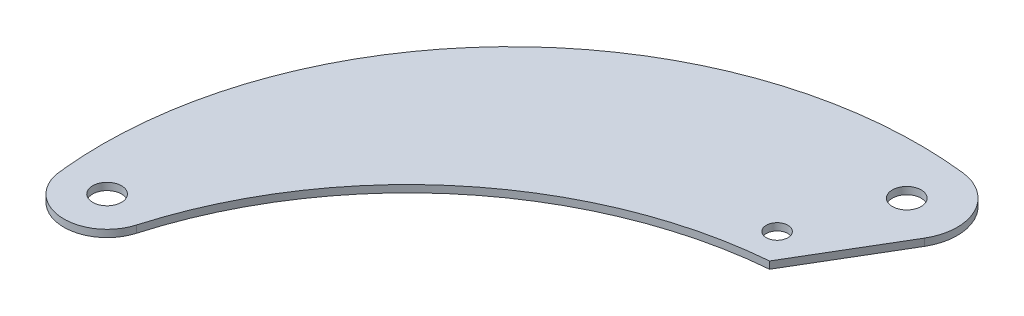
ISO-10303-21;
HEADER;
FILE_DESCRIPTION(('STEP AP214'),'2;1');
FILE_NAME('part.step','',(''),(''),'','','');
FILE_SCHEMA(('AUTOMOTIVE_DESIGN { 1 0 10303 214 1 1 1 1 }'));
ENDSEC;
DATA;
#1=APPLICATION_CONTEXT('core data for automotive mechanical design processes');
#2=APPLICATION_PROTOCOL_DEFINITION('international standard','automotive_design',2000,#1);
#3=PRODUCT_CONTEXT('',#1,'mechanical');
#4=PRODUCT('Part','Part','',(#3));
#5=PRODUCT_RELATED_PRODUCT_CATEGORY('part','',(#4));
#6=PRODUCT_DEFINITION_FORMATION('','',#4);
#7=PRODUCT_DEFINITION_CONTEXT('part definition',#1,'design');
#8=PRODUCT_DEFINITION('design','',#6,#7);
#9=PRODUCT_DEFINITION_SHAPE('','',#8);
#10=(LENGTH_UNIT() NAMED_UNIT(*) SI_UNIT(.MILLI.,.METRE.));
#11=(NAMED_UNIT(*) PLANE_ANGLE_UNIT() SI_UNIT($,.RADIAN.));
#12=(NAMED_UNIT(*) SI_UNIT($,.STERADIAN.) SOLID_ANGLE_UNIT());
#13=UNCERTAINTY_MEASURE_WITH_UNIT(LENGTH_MEASURE(1.E-05),#10,'distance_accuracy_value','');
#14=(GEOMETRIC_REPRESENTATION_CONTEXT(3) GLOBAL_UNCERTAINTY_ASSIGNED_CONTEXT((#13)) GLOBAL_UNIT_ASSIGNED_CONTEXT((#10,
#11,#12)) REPRESENTATION_CONTEXT('',''));
#15=CARTESIAN_POINT('',(0.,0.,0.));
#16=DIRECTION('',(0.,0.,1.));
#17=DIRECTION('',(1.,0.,0.));
#18=AXIS2_PLACEMENT_3D('',#15,#16,#17);
#19=CARTESIAN_POINT('',(0.,5.,0.));
#20=DIRECTION('',(0.,-1.,0.));
#21=DIRECTION('',(0.,0.,-1.));
#22=AXIS2_PLACEMENT_3D('',#19,#20,#21);
#23=CYLINDRICAL_SURFACE('',#22,566.816665425302);
#24=CARTESIAN_POINT('',(0.,-5.,0.));
#25=DIRECTION('',(0.,1.,0.));
#26=DIRECTION('',(0.,0.,1.));
#27=AXIS2_PLACEMENT_3D('',#24,#25,#26);
#28=CIRCLE('',#27,566.816665425302);
#29=CARTESIAN_POINT('',(64.2665442075099,-5.,-563.16156074388));
#30=VERTEX_POINT('',#29);
#31=CARTESIAN_POINT('',(-564.004994010368,-5.,56.3870458103971));
#32=VERTEX_POINT('',#31);
#33=EDGE_CURVE('E129',#30,#32,#28,.T.);
#34=ORIENTED_EDGE('',*,*,#33,.T.);
#35=DIRECTION('',(0.,-1.,0.));
#36=VECTOR('',#35,1.);
#37=CARTESIAN_POINT('',(-564.004994010368,5.,56.3870458103971));
#38=LINE('',#37,#36);
#39=CARTESIAN_POINT('',(-564.004994010368,5.,56.3870458103971));
#40=VERTEX_POINT('',#39);
#41=EDGE_CURVE('E11',#40,#32,#38,.T.);
#42=ORIENTED_EDGE('',*,*,#41,.F.);
#43=CARTESIAN_POINT('',(0.,5.,0.));
#44=DIRECTION('',(0.,1.,0.));
#45=DIRECTION('',(0.,0.,1.));
#46=AXIS2_PLACEMENT_3D('',#43,#44,#45);
#47=CIRCLE('',#46,566.816665425302);
#48=CARTESIAN_POINT('',(64.2665442075099,5.,-563.16156074388));
#49=VERTEX_POINT('',#48);
#50=EDGE_CURVE('E154',#49,#40,#47,.T.);
#51=ORIENTED_EDGE('',*,*,#50,.F.);
#52=DIRECTION('',(0.,-1.,0.));
#53=VECTOR('',#52,1.);
#54=CARTESIAN_POINT('',(64.2665442075099,5.,-563.16156074388));
#55=LINE('',#54,#53);
#56=EDGE_CURVE('E116',#49,#30,#55,.T.);
#57=ORIENTED_EDGE('',*,*,#56,.T.);
#58=EDGE_LOOP('',(#34,#42,#51,#57));
#59=FACE_BOUND('',#58,.T.);
#60=ADVANCED_FACE('F37',(#59),#23,.T.);
#61=CARTESIAN_POINT('',(0.,5.,56.3870458103971));
#62=DIRECTION('',(0.,0.,-1.));
#63=DIRECTION('',(-1.,0.,0.));
#64=AXIS2_PLACEMENT_3D('',#61,#62,#63);
#65=PLANE('',#64);
#66=DIRECTION('',(1.,0.,0.));
#67=VECTOR('',#66,1.);
#68=CARTESIAN_POINT('',(0.,-5.,56.3870458103971));
#69=LINE('',#68,#67);
#70=CARTESIAN_POINT('',(-563.670163318812,-5.,56.3870458103971));
#71=VERTEX_POINT('',#70);
#72=EDGE_CURVE('E132',#32,#71,#69,.T.);
#73=ORIENTED_EDGE('',*,*,#72,.T.);
#74=DIRECTION('',(0.,-1.,0.));
#75=VECTOR('',#74,1.);
#76=CARTESIAN_POINT('',(-563.670163318812,5.,56.3870458103971));
#77=LINE('',#76,#75);
#78=CARTESIAN_POINT('',(-563.670163318812,5.,56.3870458103971));
#79=VERTEX_POINT('',#78);
#80=EDGE_CURVE('E46',#79,#71,#77,.T.);
#81=ORIENTED_EDGE('',*,*,#80,.F.);
#82=DIRECTION('',(1.,0.,0.));
#83=VECTOR('',#82,1.);
#84=CARTESIAN_POINT('',(0.,5.,56.3870458103971));
#85=LINE('',#84,#83);
#86=EDGE_CURVE('E87',#40,#79,#85,.T.);
#87=ORIENTED_EDGE('',*,*,#86,.F.);
#88=ORIENTED_EDGE('',*,*,#41,.T.);
#89=EDGE_LOOP('',(#73,#81,#87,#88));
#90=FACE_BOUND('',#89,.T.);
#91=ADVANCED_FACE('F169',(#90),#65,.F.);
#92=CARTESIAN_POINT('',(-503.670163318812,5.,56.3870458103971));
#93=DIRECTION('',(0.,-1.,0.));
#94=DIRECTION('',(0.,0.,-1.));
#95=AXIS2_PLACEMENT_3D('',#92,#93,#94);
#96=CYLINDRICAL_SURFACE('',#95,60.);
#97=CARTESIAN_POINT('',(-503.670163318812,-5.,56.3870458103971));
#98=DIRECTION('',(0.,1.,0.));
#99=DIRECTION('',(0.,0.,1.));
#100=AXIS2_PLACEMENT_3D('',#97,#98,#99);
#101=CIRCLE('',#100,60.);
#102=CARTESIAN_POINT('',(-446.012064301801,-5.,72.986552361633));
#103=VERTEX_POINT('',#102);
#104=EDGE_CURVE('E134',#71,#103,#101,.T.);
#105=ORIENTED_EDGE('',*,*,#104,.T.);
#106=DIRECTION('',(0.,-1.,0.));
#107=VECTOR('',#106,1.);
#108=CARTESIAN_POINT('',(-446.012064301801,5.,72.986552361633));
#109=LINE('',#108,#107);
#110=CARTESIAN_POINT('',(-446.012064301801,5.,72.986552361633));
#111=VERTEX_POINT('',#110);
#112=EDGE_CURVE('E106',#111,#103,#109,.T.);
#113=ORIENTED_EDGE('',*,*,#112,.F.);
#114=CARTESIAN_POINT('',(-503.670163318812,5.,56.3870458103971));
#115=DIRECTION('',(0.,1.,0.));
#116=DIRECTION('',(0.,0.,1.));
#117=AXIS2_PLACEMENT_3D('',#114,#115,#116);
#118=CIRCLE('',#117,60.);
#119=EDGE_CURVE('E111',#79,#111,#118,.T.);
#120=ORIENTED_EDGE('',*,*,#119,.F.);
#121=ORIENTED_EDGE('',*,*,#80,.T.);
#122=EDGE_LOOP('',(#105,#113,#120,#121));
#123=FACE_BOUND('',#122,.T.);
#124=ADVANCED_FACE('F147',(#123),#96,.T.);
#125=CARTESIAN_POINT('',(82.5205100208026,5.,225.148695747962));
#126=DIRECTION('',(0.,-1.,0.));
#127=DIRECTION('',(0.,0.,-1.));
#128=AXIS2_PLACEMENT_3D('',#125,#126,#127);
#129=CYLINDRICAL_SURFACE('',#128,550.);
#130=CARTESIAN_POINT('',(82.5205100208026,-5.,225.148695747962));
#131=DIRECTION('',(0.,1.,0.));
#132=DIRECTION('',(0.,0.,1.));
#133=AXIS2_PLACEMENT_3D('',#130,#131,#132);
#134=CIRCLE('',#133,550.);
#135=CARTESIAN_POINT('',(36.5502440355802,-5.,-322.926786868482));
#136=VERTEX_POINT('',#135);
#137=EDGE_CURVE('E101',#136,#103,#134,.T.);
#138=ORIENTED_EDGE('',*,*,#137,.F.);
#139=DIRECTION('',(0.,-1.,0.));
#140=VECTOR('',#139,1.);
#141=CARTESIAN_POINT('',(36.5502440355802,5.,-322.926786868482));
#142=LINE('',#141,#140);
#143=CARTESIAN_POINT('',(36.5502440355802,5.,-322.926786868482));
#144=VERTEX_POINT('',#143);
#145=EDGE_CURVE('E96',#144,#136,#142,.T.);
#146=ORIENTED_EDGE('',*,*,#145,.F.);
#147=CARTESIAN_POINT('',(82.5205100208026,5.,225.148695747962));
#148=DIRECTION('',(0.,1.,0.));
#149=DIRECTION('',(0.,0.,1.));
#150=AXIS2_PLACEMENT_3D('',#147,#148,#149);
#151=CIRCLE('',#150,550.);
#152=EDGE_CURVE('E99',#144,#111,#151,.T.);
#153=ORIENTED_EDGE('',*,*,#152,.T.);
#154=ORIENTED_EDGE('',*,*,#112,.T.);
#155=EDGE_LOOP('',(#138,#146,#153,#154));
#156=FACE_BOUND('',#155,.T.);
#157=ADVANCED_FACE('F98',(#156),#129,.F.);
#158=CARTESIAN_POINT('',(-114.577912715986,5.,-67.8980223502138));
#159=DIRECTION('',(0.860291533634175,0.,0.509802390301733));
#160=DIRECTION('',(0.509802390301733,0.,-0.860291533634175));
#161=AXIS2_PLACEMENT_3D('',#158,#159,#160);
#162=PLANE('',#161);
#163=DIRECTION('',(-0.509802390301733,0.,0.860291533634174));
#164=VECTOR('',#163,1.);
#165=CARTESIAN_POINT('',(-114.577912715986,-5.,-67.8980223502138));
#166=LINE('',#165,#164);
#167=CARTESIAN_POINT('',(116.55024403558,-5.,-457.926786868482));
#168=VERTEX_POINT('',#167);
#169=EDGE_CURVE('E138',#168,#136,#166,.T.);
#170=ORIENTED_EDGE('',*,*,#169,.F.);
#171=DIRECTION('',(0.,-1.,0.));
#172=VECTOR('',#171,1.);
#173=CARTESIAN_POINT('',(116.55024403558,5.,-457.926786868482));
#174=LINE('',#173,#172);
#175=CARTESIAN_POINT('',(116.55024403558,5.,-457.926786868482));
#176=VERTEX_POINT('',#175);
#177=EDGE_CURVE('E76',#176,#168,#174,.T.);
#178=ORIENTED_EDGE('',*,*,#177,.F.);
#179=DIRECTION('',(-0.509802390301733,0.,0.860291533634174));
#180=VECTOR('',#179,1.);
#181=CARTESIAN_POINT('',(-114.577912715986,5.,-67.8980223502138));
#182=LINE('',#181,#180);
#183=EDGE_CURVE('E109',#176,#144,#182,.T.);
#184=ORIENTED_EDGE('',*,*,#183,.T.);
#185=ORIENTED_EDGE('',*,*,#145,.T.);
#186=EDGE_LOOP('',(#170,#178,#184,#185));
#187=FACE_BOUND('',#186,.T.);
#188=ADVANCED_FACE('F114',(#187),#162,.T.);
#189=CARTESIAN_POINT('',(6.32983668118791,5.,-363.612954189603));
#190=DIRECTION('',(0.,-1.,0.));
#191=DIRECTION('',(0.,0.,-1.));
#192=AXIS2_PLACEMENT_3D('',#189,#190,#191);
#193=CYLINDRICAL_SURFACE('',#192,15.);
#194=CARTESIAN_POINT('',(6.32983668118791,5.,-363.612954189603));
#195=DIRECTION('',(0.,1.,0.));
#196=DIRECTION('',(0.,0.,1.));
#197=AXIS2_PLACEMENT_3D('',#194,#195,#196);
#198=CIRCLE('',#197,15.);
#199=CARTESIAN_POINT('',(6.32983668118791,5.,-348.612954189603));
#200=VERTEX_POINT('',#199);
#201=EDGE_CURVE('E284',#200,#200,#198,.T.);
#202=ORIENTED_EDGE('',*,*,#201,.T.);
#203=EDGE_LOOP('',(#202));
#204=FACE_BOUND('',#203,.T.);
#205=CARTESIAN_POINT('',(6.32983668118791,-5.,-363.612954189603));
#206=DIRECTION('',(0.,1.,0.));
#207=DIRECTION('',(0.,0.,1.));
#208=AXIS2_PLACEMENT_3D('',#205,#206,#207);
#209=CIRCLE('',#208,15.);
#210=CARTESIAN_POINT('',(6.32983668118791,-5.,-348.612954189603));
#211=VERTEX_POINT('',#210);
#212=EDGE_CURVE('E126',#211,#211,#209,.T.);
#213=ORIENTED_EDGE('',*,*,#212,.F.);
#214=EDGE_LOOP('',(#213));
#215=FACE_BOUND('',#214,.T.);
#216=ADVANCED_FACE('F177',(#204,#215),#193,.F.);
#217=CARTESIAN_POINT('',(-503.670163318812,5.,56.3870458103971));
#218=DIRECTION('',(0.,-1.,0.));
#219=DIRECTION('',(0.,0.,-1.));
#220=AXIS2_PLACEMENT_3D('',#217,#218,#219);
#221=CYLINDRICAL_SURFACE('',#220,20.);
#222=CARTESIAN_POINT('',(-503.670163318812,5.,56.3870458103971));
#223=DIRECTION('',(0.,1.,0.));
#224=DIRECTION('',(0.,0.,1.));
#225=AXIS2_PLACEMENT_3D('',#222,#223,#224);
#226=CIRCLE('',#225,20.);
#227=CARTESIAN_POINT('',(-503.670163318812,5.,76.387045810397));
#228=VERTEX_POINT('',#227);
#229=EDGE_CURVE('E187',#228,#228,#226,.T.);
#230=ORIENTED_EDGE('',*,*,#229,.T.);
#231=EDGE_LOOP('',(#230));
#232=FACE_BOUND('',#231,.T.);
#233=CARTESIAN_POINT('',(-503.670163318812,-5.,56.3870458103971));
#234=DIRECTION('',(0.,1.,0.));
#235=DIRECTION('',(0.,0.,1.));
#236=AXIS2_PLACEMENT_3D('',#233,#234,#235);
#237=CIRCLE('',#236,20.);
#238=CARTESIAN_POINT('',(-503.670163318812,-5.,76.387045810397));
#239=VERTEX_POINT('',#238);
#240=EDGE_CURVE('E123',#239,#239,#237,.T.);
#241=ORIENTED_EDGE('',*,*,#240,.F.);
#242=EDGE_LOOP('',(#241));
#243=FACE_BOUND('',#242,.T.);
#244=ADVANCED_FACE('F164',(#232,#243),#221,.F.);
#245=CARTESIAN_POINT('',(56.3298366811879,5.,-493.612954189603));
#246=DIRECTION('',(0.,-1.,0.));
#247=DIRECTION('',(0.,0.,-1.));
#248=AXIS2_PLACEMENT_3D('',#245,#246,#247);
#249=CYLINDRICAL_SURFACE('',#248,20.);
#250=CARTESIAN_POINT('',(56.3298366811879,5.,-493.612954189603));
#251=DIRECTION('',(0.,1.,0.));
#252=DIRECTION('',(0.,0.,1.));
#253=AXIS2_PLACEMENT_3D('',#250,#251,#252);
#254=CIRCLE('',#253,20.);
#255=CARTESIAN_POINT('',(56.3298366811879,5.,-473.612954189603));
#256=VERTEX_POINT('',#255);
#257=EDGE_CURVE('E141',#256,#256,#254,.T.);
#258=ORIENTED_EDGE('',*,*,#257,.T.);
#259=EDGE_LOOP('',(#258));
#260=FACE_BOUND('',#259,.T.);
#261=CARTESIAN_POINT('',(56.3298366811879,-5.,-493.612954189603));
#262=DIRECTION('',(0.,1.,0.));
#263=DIRECTION('',(0.,0.,1.));
#264=AXIS2_PLACEMENT_3D('',#261,#262,#263);
#265=CIRCLE('',#264,20.);
#266=CARTESIAN_POINT('',(56.3298366811879,-5.,-473.612954189603));
#267=VERTEX_POINT('',#266);
#268=EDGE_CURVE('E120',#267,#267,#265,.T.);
#269=ORIENTED_EDGE('',*,*,#268,.F.);
#270=EDGE_LOOP('',(#269));
#271=FACE_BOUND('',#270,.T.);
#272=ADVANCED_FACE('F39',(#260,#271),#249,.F.);
#273=CARTESIAN_POINT('',(56.3298366811879,5.,-493.612954189603));
#274=DIRECTION('',(0.,-1.,0.));
#275=DIRECTION('',(0.,0.,-1.));
#276=AXIS2_PLACEMENT_3D('',#273,#274,#275);
#277=CYLINDRICAL_SURFACE('',#276,70.);
#278=CARTESIAN_POINT('',(56.3298366811879,-5.,-493.612954189603));
#279=DIRECTION('',(0.,1.,0.));
#280=DIRECTION('',(0.,0.,1.));
#281=AXIS2_PLACEMENT_3D('',#278,#279,#280);
#282=CIRCLE('',#281,70.);
#283=EDGE_CURVE('E79',#168,#30,#282,.T.);
#284=ORIENTED_EDGE('',*,*,#283,.T.);
#285=ORIENTED_EDGE('',*,*,#56,.F.);
#286=CARTESIAN_POINT('',(56.3298366811879,5.,-493.612954189603));
#287=DIRECTION('',(0.,1.,0.));
#288=DIRECTION('',(0.,0.,1.));
#289=AXIS2_PLACEMENT_3D('',#286,#287,#288);
#290=CIRCLE('',#289,70.);
#291=EDGE_CURVE('E54',#176,#49,#290,.T.);
#292=ORIENTED_EDGE('',*,*,#291,.F.);
#293=ORIENTED_EDGE('',*,*,#177,.T.);
#294=EDGE_LOOP('',(#284,#285,#292,#293));
#295=FACE_BOUND('',#294,.T.);
#296=ADVANCED_FACE('F155',(#295),#277,.T.);
#297=CARTESIAN_POINT('',(0.,5.,0.));
#298=DIRECTION('',(0.,1.,0.));
#299=DIRECTION('',(0.,0.,1.));
#300=AXIS2_PLACEMENT_3D('',#297,#298,#299);
#301=PLANE('',#300);
#302=ORIENTED_EDGE('',*,*,#257,.F.);
#303=EDGE_LOOP('',(#302));
#304=FACE_BOUND('',#303,.T.);
#305=ORIENTED_EDGE('',*,*,#229,.F.);
#306=EDGE_LOOP('',(#305));
#307=FACE_BOUND('',#306,.T.);
#308=ORIENTED_EDGE('',*,*,#201,.F.);
#309=EDGE_LOOP('',(#308));
#310=FACE_BOUND('',#309,.T.);
#311=ORIENTED_EDGE('',*,*,#50,.T.);
#312=ORIENTED_EDGE('',*,*,#86,.T.);
#313=ORIENTED_EDGE('',*,*,#119,.T.);
#314=ORIENTED_EDGE('',*,*,#152,.F.);
#315=ORIENTED_EDGE('',*,*,#183,.F.);
#316=ORIENTED_EDGE('',*,*,#291,.T.);
#317=EDGE_LOOP('',(#311,#312,#313,#314,#315,#316));
#318=FACE_BOUND('',#317,.T.);
#319=ADVANCED_FACE('F108',(#304,#307,#310,#318),#301,.T.);
#320=CARTESIAN_POINT('',(0.,-5.,0.));
#321=DIRECTION('',(0.,1.,0.));
#322=DIRECTION('',(0.,0.,1.));
#323=AXIS2_PLACEMENT_3D('',#320,#321,#322);
#324=PLANE('',#323);
#325=ORIENTED_EDGE('',*,*,#268,.T.);
#326=EDGE_LOOP('',(#325));
#327=FACE_BOUND('',#326,.T.);
#328=ORIENTED_EDGE('',*,*,#240,.T.);
#329=EDGE_LOOP('',(#328));
#330=FACE_BOUND('',#329,.T.);
#331=ORIENTED_EDGE('',*,*,#212,.T.);
#332=EDGE_LOOP('',(#331));
#333=FACE_BOUND('',#332,.T.);
#334=ORIENTED_EDGE('',*,*,#33,.F.);
#335=ORIENTED_EDGE('',*,*,#283,.F.);
#336=ORIENTED_EDGE('',*,*,#169,.T.);
#337=ORIENTED_EDGE('',*,*,#137,.T.);
#338=ORIENTED_EDGE('',*,*,#104,.F.);
#339=ORIENTED_EDGE('',*,*,#72,.F.);
#340=EDGE_LOOP('',(#334,#335,#336,#337,#338,#339));
#341=FACE_BOUND('',#340,.T.);
#342=ADVANCED_FACE('F150',(#327,#330,#333,#341),#324,.F.);
#343=CLOSED_SHELL('',(#60,#91,#124,#157,#188,#216,#244,#272,#296,#319,#342));
#344=MANIFOLD_SOLID_BREP('B2',#343);
#345=ADVANCED_BREP_SHAPE_REPRESENTATION('',(#18,#344),#14);
#346=SHAPE_DEFINITION_REPRESENTATION(#9,#345);
ENDSEC;
END-ISO-10303-21;
